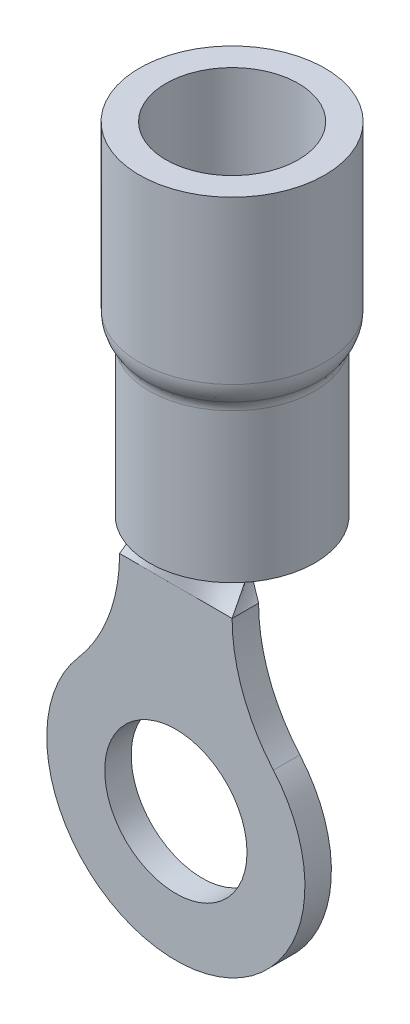
ISO-10303-21;
HEADER;
FILE_DESCRIPTION(('STEP AP214'),'2;1');
FILE_NAME('part.step','',(''),(''),'','','');
FILE_SCHEMA(('AUTOMOTIVE_DESIGN { 1 0 10303 214 1 1 1 1 }'));
ENDSEC;
DATA;
#1=APPLICATION_CONTEXT('core data for automotive mechanical design processes');
#2=APPLICATION_PROTOCOL_DEFINITION('international standard','automotive_design',2000,#1);
#3=PRODUCT_CONTEXT('',#1,'mechanical');
#4=PRODUCT('Part','Part','',(#3));
#5=PRODUCT_RELATED_PRODUCT_CATEGORY('part','',(#4));
#6=PRODUCT_DEFINITION_FORMATION('','',#4);
#7=PRODUCT_DEFINITION_CONTEXT('part definition',#1,'design');
#8=PRODUCT_DEFINITION('design','',#6,#7);
#9=PRODUCT_DEFINITION_SHAPE('','',#8);
#10=(LENGTH_UNIT() NAMED_UNIT(*) SI_UNIT(.MILLI.,.METRE.));
#11=(NAMED_UNIT(*) PLANE_ANGLE_UNIT() SI_UNIT($,.RADIAN.));
#12=(NAMED_UNIT(*) SI_UNIT($,.STERADIAN.) SOLID_ANGLE_UNIT());
#13=UNCERTAINTY_MEASURE_WITH_UNIT(LENGTH_MEASURE(1.E-05),#10,'distance_accuracy_value','');
#14=(GEOMETRIC_REPRESENTATION_CONTEXT(3) GLOBAL_UNCERTAINTY_ASSIGNED_CONTEXT((#13)) GLOBAL_UNIT_ASSIGNED_CONTEXT((#10,
#11,#12)) REPRESENTATION_CONTEXT('',''));
#15=CARTESIAN_POINT('',(0.,0.,0.));
#16=DIRECTION('',(0.,0.,1.));
#17=DIRECTION('',(1.,0.,0.));
#18=AXIS2_PLACEMENT_3D('',#15,#16,#17);
#19=CARTESIAN_POINT('',(-6.811363636364,0.,0.));
#20=DIRECTION('',(0.,0.,1.));
#21=DIRECTION('',(1.,0.,0.));
#22=AXIS2_PLACEMENT_3D('',#19,#20,#21);
#23=CYLINDRICAL_SURFACE('',#22,5.111363636364);
#24=DIRECTION('',(0.,0.,-1.));
#25=VECTOR('',#24,1.);
#26=CARTESIAN_POINT('',(-2.947868852459,-3.346557377049,0.));
#27=LINE('',#26,#25);
#28=CARTESIAN_POINT('',(-2.947868852459,-3.346557377049,0.));
#29=VERTEX_POINT('',#28);
#30=CARTESIAN_POINT('',(-2.947868852459,-3.346557377049,-0.8));
#31=VERTEX_POINT('',#30);
#32=EDGE_CURVE('E12',#29,#31,#27,.T.);
#33=ORIENTED_EDGE('',*,*,#32,.F.);
#34=CARTESIAN_POINT('',(-6.811363636364,0.,0.));
#35=DIRECTION('',(0.,0.,1.));
#36=DIRECTION('',(1.,0.,0.));
#37=AXIS2_PLACEMENT_3D('',#34,#35,#36);
#38=CIRCLE('',#37,5.111363636364);
#39=CARTESIAN_POINT('',(-1.7,0.,0.));
#40=VERTEX_POINT('',#39);
#41=EDGE_CURVE('E125',#29,#40,#38,.T.);
#42=ORIENTED_EDGE('',*,*,#41,.T.);
#43=DIRECTION('',(0.,0.,-1.));
#44=VECTOR('',#43,1.);
#45=CARTESIAN_POINT('',(-1.7,0.,0.));
#46=LINE('',#45,#44);
#47=CARTESIAN_POINT('',(-1.7,0.,-0.8));
#48=VERTEX_POINT('',#47);
#49=EDGE_CURVE('E146',#40,#48,#46,.T.);
#50=ORIENTED_EDGE('',*,*,#49,.T.);
#51=CARTESIAN_POINT('',(-6.811363636364,0.,-0.8));
#52=DIRECTION('',(0.,0.,1.));
#53=DIRECTION('',(1.,0.,0.));
#54=AXIS2_PLACEMENT_3D('',#51,#52,#53);
#55=CIRCLE('',#54,5.111363636364);
#56=EDGE_CURVE('E67',#31,#48,#55,.T.);
#57=ORIENTED_EDGE('',*,*,#56,.F.);
#58=EDGE_LOOP('',(#33,#42,#50,#57));
#59=FACE_BOUND('',#58,.T.);
#60=ADVANCED_FACE('F56',(#59),#23,.F.);
#61=CARTESIAN_POINT('',(0.,-5.9,0.));
#62=DIRECTION('',(0.,0.,1.));
#63=DIRECTION('',(1.,0.,0.));
#64=AXIS2_PLACEMENT_3D('',#61,#62,#63);
#65=CYLINDRICAL_SURFACE('',#64,3.9);
#66=CARTESIAN_POINT('',(0.,-5.9,0.));
#67=DIRECTION('',(0.,0.,1.));
#68=DIRECTION('',(1.,0.,0.));
#69=AXIS2_PLACEMENT_3D('',#66,#67,#68);
#70=CIRCLE('',#69,3.9);
#71=CARTESIAN_POINT('',(2.947868852459,-3.346557377049,0.));
#72=VERTEX_POINT('',#71);
#73=EDGE_CURVE('E60',#29,#72,#70,.T.);
#74=ORIENTED_EDGE('',*,*,#73,.F.);
#75=ORIENTED_EDGE('',*,*,#32,.T.);
#76=CARTESIAN_POINT('',(0.,-5.9,-0.8));
#77=DIRECTION('',(0.,0.,1.));
#78=DIRECTION('',(1.,0.,0.));
#79=AXIS2_PLACEMENT_3D('',#76,#77,#78);
#80=CIRCLE('',#79,3.9);
#81=CARTESIAN_POINT('',(2.947868852459,-3.346557377049,-0.8));
#82=VERTEX_POINT('',#81);
#83=EDGE_CURVE('E80',#31,#82,#80,.T.);
#84=ORIENTED_EDGE('',*,*,#83,.T.);
#85=DIRECTION('',(0.,0.,-1.));
#86=VECTOR('',#85,1.);
#87=CARTESIAN_POINT('',(2.947868852459,-3.346557377049,0.));
#88=LINE('',#87,#86);
#89=EDGE_CURVE('E117',#72,#82,#88,.T.);
#90=ORIENTED_EDGE('',*,*,#89,.F.);
#91=EDGE_LOOP('',(#74,#75,#84,#90));
#92=FACE_BOUND('',#91,.T.);
#93=ADVANCED_FACE('F58',(#92),#65,.T.);
#94=CARTESIAN_POINT('',(6.811363636364,0.,0.));
#95=DIRECTION('',(0.,0.,1.));
#96=DIRECTION('',(1.,0.,0.));
#97=AXIS2_PLACEMENT_3D('',#94,#95,#96);
#98=CYLINDRICAL_SURFACE('',#97,5.111363636364);
#99=DIRECTION('',(0.,0.,-1.));
#100=VECTOR('',#99,1.);
#101=CARTESIAN_POINT('',(1.7,0.,0.));
#102=LINE('',#101,#100);
#103=CARTESIAN_POINT('',(1.7,0.,0.));
#104=VERTEX_POINT('',#103);
#105=CARTESIAN_POINT('',(1.7,0.,-0.8));
#106=VERTEX_POINT('',#105);
#107=EDGE_CURVE('E119',#104,#106,#102,.T.);
#108=ORIENTED_EDGE('',*,*,#107,.F.);
#109=CARTESIAN_POINT('',(6.811363636364,0.,0.));
#110=DIRECTION('',(0.,0.,1.));
#111=DIRECTION('',(1.,0.,0.));
#112=AXIS2_PLACEMENT_3D('',#109,#110,#111);
#113=CIRCLE('',#112,5.111363636364);
#114=EDGE_CURVE('E114',#104,#72,#113,.T.);
#115=ORIENTED_EDGE('',*,*,#114,.T.);
#116=ORIENTED_EDGE('',*,*,#89,.T.);
#117=CARTESIAN_POINT('',(6.811363636364,0.,-0.8));
#118=DIRECTION('',(0.,0.,1.));
#119=DIRECTION('',(1.,0.,0.));
#120=AXIS2_PLACEMENT_3D('',#117,#118,#119);
#121=CIRCLE('',#120,5.111363636364);
#122=EDGE_CURVE('E106',#106,#82,#121,.T.);
#123=ORIENTED_EDGE('',*,*,#122,.F.);
#124=EDGE_LOOP('',(#108,#115,#116,#123));
#125=FACE_BOUND('',#124,.T.);
#126=ADVANCED_FACE('F116',(#125),#98,.F.);
#127=CARTESIAN_POINT('',(-1.7,0.,0.));
#128=DIRECTION('',(0.,1.,0.));
#129=DIRECTION('',(1.,0.,0.));
#130=AXIS2_PLACEMENT_3D('',#127,#128,#129);
#131=PLANE('',#130);
#132=ORIENTED_EDGE('',*,*,#49,.F.);
#133=DIRECTION('',(1.,0.,0.));
#134=VECTOR('',#133,1.);
#135=CARTESIAN_POINT('',(-1.7,0.,0.));
#136=LINE('',#135,#134);
#137=EDGE_CURVE('E124',#40,#104,#136,.T.);
#138=ORIENTED_EDGE('',*,*,#137,.T.);
#139=ORIENTED_EDGE('',*,*,#107,.T.);
#140=DIRECTION('',(1.,0.,0.));
#141=VECTOR('',#140,1.);
#142=CARTESIAN_POINT('',(-1.7,0.,-0.8));
#143=LINE('',#142,#141);
#144=EDGE_CURVE('E149',#48,#106,#143,.T.);
#145=ORIENTED_EDGE('',*,*,#144,.F.);
#146=EDGE_LOOP('',(#132,#138,#139,#145));
#147=FACE_BOUND('',#146,.T.);
#148=ADVANCED_FACE('F192',(#147),#131,.T.);
#149=CARTESIAN_POINT('',(0.,-5.9,0.));
#150=DIRECTION('',(0.,0.,1.));
#151=DIRECTION('',(1.,0.,0.));
#152=AXIS2_PLACEMENT_3D('',#149,#150,#151);
#153=CYLINDRICAL_SURFACE('',#152,2.15);
#154=DIRECTION('',(0.,0.,-1.));
#155=VECTOR('',#154,1.);
#156=CARTESIAN_POINT('',(2.15,-5.9,0.));
#157=LINE('',#156,#155);
#158=CARTESIAN_POINT('',(2.15,-5.9,0.));
#159=VERTEX_POINT('',#158);
#160=CARTESIAN_POINT('',(2.15,-5.9,-0.8));
#161=VERTEX_POINT('',#160);
#162=EDGE_CURVE('E151',#159,#161,#157,.T.);
#163=ORIENTED_EDGE('',*,*,#162,.F.);
#164=CARTESIAN_POINT('',(0.,-5.9,0.));
#165=DIRECTION('',(0.,0.,1.));
#166=DIRECTION('',(1.,0.,0.));
#167=AXIS2_PLACEMENT_3D('',#164,#165,#166);
#168=CIRCLE('',#167,2.15);
#169=EDGE_CURVE('E278',#159,#159,#168,.T.);
#170=ORIENTED_EDGE('',*,*,#169,.T.);
#171=ORIENTED_EDGE('',*,*,#162,.T.);
#172=CARTESIAN_POINT('',(0.,-5.9,-0.8));
#173=DIRECTION('',(0.,0.,1.));
#174=DIRECTION('',(1.,0.,0.));
#175=AXIS2_PLACEMENT_3D('',#172,#173,#174);
#176=CIRCLE('',#175,2.15);
#177=EDGE_CURVE('E154',#161,#161,#176,.T.);
#178=ORIENTED_EDGE('',*,*,#177,.F.);
#179=EDGE_LOOP('',(#163,#170,#171,#178));
#180=FACE_BOUND('',#179,.T.);
#181=ADVANCED_FACE('F186',(#180),#153,.F.);
#182=CARTESIAN_POINT('',(0.,-5.013028675875,0.));
#183=DIRECTION('',(0.,0.,-1.));
#184=DIRECTION('',(1.,0.,0.));
#185=AXIS2_PLACEMENT_3D('',#182,#183,#184);
#186=PLANE('',#185);
#187=ORIENTED_EDGE('',*,*,#137,.F.);
#188=ORIENTED_EDGE('',*,*,#41,.F.);
#189=ORIENTED_EDGE('',*,*,#73,.T.);
#190=ORIENTED_EDGE('',*,*,#114,.F.);
#191=EDGE_LOOP('',(#187,#188,#189,#190));
#192=FACE_BOUND('',#191,.T.);
#193=ORIENTED_EDGE('',*,*,#169,.F.);
#194=EDGE_LOOP('',(#193));
#195=FACE_BOUND('',#194,.T.);
#196=ADVANCED_FACE('F131',(#192,#195),#186,.F.);
#197=CARTESIAN_POINT('',(0.,-5.013028675875,-0.8));
#198=DIRECTION('',(0.,0.,-1.));
#199=DIRECTION('',(1.,0.,0.));
#200=AXIS2_PLACEMENT_3D('',#197,#198,#199);
#201=PLANE('',#200);
#202=ORIENTED_EDGE('',*,*,#56,.T.);
#203=ORIENTED_EDGE('',*,*,#144,.T.);
#204=ORIENTED_EDGE('',*,*,#122,.T.);
#205=ORIENTED_EDGE('',*,*,#83,.F.);
#206=EDGE_LOOP('',(#202,#203,#204,#205));
#207=FACE_BOUND('',#206,.T.);
#208=ORIENTED_EDGE('',*,*,#177,.T.);
#209=EDGE_LOOP('',(#208));
#210=FACE_BOUND('',#209,.T.);
#211=ADVANCED_FACE('F200',(#207,#210),#201,.T.);
#212=CLOSED_SHELL('',(#60,#93,#126,#148,#181,#196,#211));
#213=MANIFOLD_SOLID_BREP('B2',#212);
#214=CARTESIAN_POINT('',(1.472243186433,1.,-0.85));
#215=CARTESIAN_POINT('',(1.7,0.,-4.101163852965E-13));
#216=CARTESIAN_POINT('',(0.779422559986,1.,-1.25000017518));
#217=CARTESIAN_POINT('',(1.7,0.,-0.8));
#218=(BOUNDED_SURFACE() B_SPLINE_SURFACE(1,1,((#214,#215),(#216,#217)),.UNSPECIFIED.,.F.,.F.,
.F.) B_SPLINE_SURFACE_WITH_KNOTS((2,2),(2,2),(-0.80000035036,0.),(0.,1.),
.UNSPECIFIED.) GEOMETRIC_REPRESENTATION_ITEM() RATIONAL_B_SPLINE_SURFACE(((1.,1.),(1.,1.))) REPRESENTATION_ITEM('') SURFACE());
#219=DIRECTION('',(-0.866025403784329,0.,-0.50000000000019));
#220=VECTOR('',#219,1.);
#221=CARTESIAN_POINT('',(0.779422559986,1.,-1.25000017518));
#222=LINE('',#221,#220);
#223=CARTESIAN_POINT('',(1.472243186433,1.,-0.85));
#224=VERTEX_POINT('',#223);
#225=CARTESIAN_POINT('',(0.779422559985,1.,-1.25000017518));
#226=VERTEX_POINT('',#225);
#227=EDGE_CURVE('E54',#224,#226,#222,.T.);
#228=CARTESIAN_POINT('',(1.472243186433,1.,-0.85));
#229=CARTESIAN_POINT('',(1.7,0.,-4.101163852965E-13));
#230=(BOUNDED_CURVE() B_SPLINE_CURVE(1,(#228,#229),.UNSPECIFIED.,.F.,
.F.) B_SPLINE_CURVE_WITH_KNOTS((2,2),(0.,1.),
.UNSPECIFIED.) CURVE() GEOMETRIC_REPRESENTATION_ITEM() RATIONAL_B_SPLINE_CURVE((1.,1.)) REPRESENTATION_ITEM(''));
#231=CARTESIAN_POINT('',(1.7,0.,-4.101163852965E-13));
#232=VERTEX_POINT('',#231);
#233=EDGE_CURVE('E394',#224,#232,#230,.T.);
#234=DIRECTION('',(0.,0.,1.));
#235=VECTOR('',#234,1.);
#236=CARTESIAN_POINT('',(1.7,0.,-0.8));
#237=LINE('',#236,#235);
#238=CARTESIAN_POINT('',(1.7,0.,-0.8));
#239=VERTEX_POINT('',#238);
#240=EDGE_CURVE('E389',#239,#232,#237,.T.);
#241=CARTESIAN_POINT('',(0.779422559986,1.,-1.25000017518));
#242=CARTESIAN_POINT('',(1.7,0.,-0.8));
#243=(BOUNDED_CURVE() B_SPLINE_CURVE(1,(#241,#242),.UNSPECIFIED.,.F.,
.F.) B_SPLINE_CURVE_WITH_KNOTS((2,2),(0.,1.),
.UNSPECIFIED.) CURVE() GEOMETRIC_REPRESENTATION_ITEM() RATIONAL_B_SPLINE_CURVE((1.,1.)) REPRESENTATION_ITEM(''));
#244=EDGE_CURVE('E343',#226,#239,#243,.T.);
#245=ORIENTED_EDGE('',*,*,#227,.F.);
#246=ORIENTED_EDGE('',*,*,#233,.T.);
#247=ORIENTED_EDGE('',*,*,#240,.F.);
#248=ORIENTED_EDGE('',*,*,#244,.F.);
#249=EDGE_LOOP('',(#245,#246,#247,#248));
#250=FACE_BOUND('',#249,.T.);
#251=ADVANCED_FACE('F332',(#250),#218,.F.);
#252=CARTESIAN_POINT('',(0.779422559985,1.,-1.25000017518));
#253=CARTESIAN_POINT('',(1.7,0.,-0.8));
#254=CARTESIAN_POINT('',(0.661612881338,1.,-1.045947720225));
#255=CARTESIAN_POINT('',(1.275,0.,-0.8));
#256=CARTESIAN_POINT('',(0.482749875849,1.,-0.87714376313));
#257=CARTESIAN_POINT('',(0.85,0.,-0.8));
#258=CARTESIAN_POINT('',(0.255145395893,1.,-0.764900349193));
#259=CARTESIAN_POINT('',(0.425,0.,-0.8));
#260=CARTESIAN_POINT('',(-1.8550688458E-07,1.,-0.725370883051));
#261=CARTESIAN_POINT('',(2.2692E-13,0.,-0.8));
#262=CARTESIAN_POINT('',(-0.255145784675,1.,-0.764900234502));
#263=CARTESIAN_POINT('',(-0.425,0.,-0.8));
#264=CARTESIAN_POINT('',(-0.482750315087,1.,-0.877143546128));
#265=CARTESIAN_POINT('',(-0.85,0.,-0.8));
#266=CARTESIAN_POINT('',(-0.661613396455,1.,-1.045947422822));
#267=CARTESIAN_POINT('',(-1.275,0.,-0.8));
#268=CARTESIAN_POINT('',(-0.779423166826,1.,-1.24999982482));
#269=CARTESIAN_POINT('',(-1.7,0.,-0.8));
#270=(BOUNDED_SURFACE() B_SPLINE_SURFACE(8,1,((#252,#253),(#254,#255),(#256,#257),(#258,#259),
(#260,#261),(#262,#263),(#264,#265),(#266,#267),(#268,#269)),.UNSPECIFIED.,.F.,.F.,
.F.) B_SPLINE_SURFACE_WITH_KNOTS((9,9),(2,2),(-3.4,0.),(0.,1.),
.UNSPECIFIED.) GEOMETRIC_REPRESENTATION_ITEM() RATIONAL_B_SPLINE_SURFACE(((1.,1.),(1.,1.),(1.,
1.),(1.,1.),(1.,1.),(1.,1.),(1.,1.),(1.,1.),(1.,1.))) REPRESENTATION_ITEM('') SURFACE());
#271=CARTESIAN_POINT('',(-4.045605237E-07,1.,-1.7));
#272=DIRECTION('',(0.,-1.,0.));
#273=DIRECTION('',(1.,0.,0.));
#274=AXIS2_PLACEMENT_3D('',#271,#272,#273);
#275=CIRCLE('',#274,0.9);
#276=CARTESIAN_POINT('',(-0.779423166826,1.,-1.24999982482));
#277=VERTEX_POINT('',#276);
#278=EDGE_CURVE('E356',#226,#277,#275,.T.);
#279=DIRECTION('',(1.,0.,0.));
#280=VECTOR('',#279,1.);
#281=CARTESIAN_POINT('',(-1.7,0.,-0.8));
#282=LINE('',#281,#280);
#283=CARTESIAN_POINT('',(-1.7,0.,-0.8));
#284=VERTEX_POINT('',#283);
#285=EDGE_CURVE('E336',#284,#239,#282,.T.);
#286=CARTESIAN_POINT('',(-0.779423166826,1.,-1.24999982482));
#287=CARTESIAN_POINT('',(-1.7,0.,-0.8));
#288=(BOUNDED_CURVE() B_SPLINE_CURVE(1,(#286,#287),.UNSPECIFIED.,.F.,
.F.) B_SPLINE_CURVE_WITH_KNOTS((2,2),(0.,1.),
.UNSPECIFIED.) CURVE() GEOMETRIC_REPRESENTATION_ITEM() RATIONAL_B_SPLINE_CURVE((1.,1.)) REPRESENTATION_ITEM(''));
#289=EDGE_CURVE('E407',#277,#284,#288,.T.);
#290=ORIENTED_EDGE('',*,*,#278,.F.);
#291=ORIENTED_EDGE('',*,*,#244,.T.);
#292=ORIENTED_EDGE('',*,*,#285,.F.);
#293=ORIENTED_EDGE('',*,*,#289,.F.);
#294=EDGE_LOOP('',(#290,#291,#292,#293));
#295=FACE_BOUND('',#294,.T.);
#296=ADVANCED_FACE('F445',(#295),#270,.F.);
#297=CARTESIAN_POINT('',(-0.779423166826,1.,-1.24999982482));
#298=CARTESIAN_POINT('',(-1.7,0.,-0.8));
#299=CARTESIAN_POINT('',(-1.472243186433,1.,-0.85));
#300=CARTESIAN_POINT('',(-1.7,0.,-4.101163852965E-13));
#301=(BOUNDED_SURFACE() B_SPLINE_SURFACE(1,1,((#297,#298),(#299,#300)),.UNSPECIFIED.,.F.,.F.,
.F.) B_SPLINE_SURFACE_WITH_KNOTS((2,2),(2,2),(-0.8,0.),(0.,1.),
.UNSPECIFIED.) GEOMETRIC_REPRESENTATION_ITEM() RATIONAL_B_SPLINE_SURFACE(((1.,1.),(1.,1.))) REPRESENTATION_ITEM('') SURFACE());
#302=DIRECTION('',(-0.866025403784579,0.,0.499999999999757));
#303=VECTOR('',#302,1.);
#304=CARTESIAN_POINT('',(-0.779423166826,1.,-1.24999982482));
#305=LINE('',#304,#303);
#306=CARTESIAN_POINT('',(-1.472243186433,1.,-0.85));
#307=VERTEX_POINT('',#306);
#308=EDGE_CURVE('E404',#277,#307,#305,.T.);
#309=DIRECTION('',(0.,0.,-1.));
#310=VECTOR('',#309,1.);
#311=CARTESIAN_POINT('',(-1.7,0.,-4.101163852965E-13));
#312=LINE('',#311,#310);
#313=CARTESIAN_POINT('',(-1.7,0.,-4.101163852965E-13));
#314=VERTEX_POINT('',#313);
#315=EDGE_CURVE('E386',#314,#284,#312,.T.);
#316=CARTESIAN_POINT('',(-1.472243186433,1.,-0.85));
#317=CARTESIAN_POINT('',(-1.7,0.,-4.101163852965E-13));
#318=(BOUNDED_CURVE() B_SPLINE_CURVE(1,(#316,#317),.UNSPECIFIED.,.F.,
.F.) B_SPLINE_CURVE_WITH_KNOTS((2,2),(0.,1.),
.UNSPECIFIED.) CURVE() GEOMETRIC_REPRESENTATION_ITEM() RATIONAL_B_SPLINE_CURVE((1.,1.)) REPRESENTATION_ITEM(''));
#319=EDGE_CURVE('E397',#307,#314,#318,.T.);
#320=ORIENTED_EDGE('',*,*,#308,.F.);
#321=ORIENTED_EDGE('',*,*,#289,.T.);
#322=ORIENTED_EDGE('',*,*,#315,.F.);
#323=ORIENTED_EDGE('',*,*,#319,.F.);
#324=EDGE_LOOP('',(#320,#321,#322,#323));
#325=FACE_BOUND('',#324,.T.);
#326=ADVANCED_FACE('F406',(#325),#301,.F.);
#327=CARTESIAN_POINT('',(-1.472243186433,1.,-0.85));
#328=CARTESIAN_POINT('',(-1.7,0.,-4.096722960867E-13));
#329=CARTESIAN_POINT('',(-1.249713706804,1.,-0.4645676351));
#330=CARTESIAN_POINT('',(-1.275,0.,-4.096722960867E-13));
#331=CARTESIAN_POINT('',(-0.91186129144,1.,-0.145715792077));
#332=CARTESIAN_POINT('',(-0.85,0.,-4.096722960867E-13));
#333=CARTESIAN_POINT('',(-0.481941670537,1.,0.06629944873295));
#334=CARTESIAN_POINT('',(-0.425,0.,-4.096722960867E-13));
#335=CARTESIAN_POINT('',(0.,1.,0.140966109792));
#336=CARTESIAN_POINT('',(2.2694E-13,0.,-4.096722960867E-13));
#337=CARTESIAN_POINT('',(0.481941670537,1.,0.06629944873292));
#338=CARTESIAN_POINT('',(0.425,0.,-4.096722960867E-13));
#339=CARTESIAN_POINT('',(0.91186129144,1.,-0.145715792077));
#340=CARTESIAN_POINT('',(0.85,0.,-4.096722960867E-13));
#341=CARTESIAN_POINT('',(1.249713706804,1.,-0.4645676351));
#342=CARTESIAN_POINT('',(1.275,0.,-4.096722960867E-13));
#343=CARTESIAN_POINT('',(1.472243186433,1.,-0.85));
#344=CARTESIAN_POINT('',(1.7,0.,-4.096722960867E-13));
#345=(BOUNDED_SURFACE() B_SPLINE_SURFACE(8,1,((#327,#328),(#329,#330),(#331,#332),(#333,#334),
(#335,#336),(#337,#338),(#339,#340),(#341,#342),(#343,#344)),.UNSPECIFIED.,.F.,.F.,
.F.) B_SPLINE_SURFACE_WITH_KNOTS((9,9),(2,2),(-3.4,0.),(0.,1.),
.UNSPECIFIED.) GEOMETRIC_REPRESENTATION_ITEM() RATIONAL_B_SPLINE_SURFACE(((1.,1.),(1.,1.),(1.,
1.),(1.,1.),(1.,1.),(1.,1.),(1.,1.),(1.,1.),(1.,1.))) REPRESENTATION_ITEM('') SURFACE());
#346=CARTESIAN_POINT('',(0.,1.,-1.7));
#347=DIRECTION('',(0.,1.,0.));
#348=DIRECTION('',(1.,0.,0.));
#349=AXIS2_PLACEMENT_3D('',#346,#347,#348);
#350=CIRCLE('',#349,1.7);
#351=EDGE_CURVE('E399',#307,#224,#350,.T.);
#352=DIRECTION('',(-1.,0.,0.));
#353=VECTOR('',#352,1.);
#354=CARTESIAN_POINT('',(1.7,0.,-4.101163852965E-13));
#355=LINE('',#354,#353);
#356=EDGE_CURVE('E383',#232,#314,#355,.T.);
#357=ORIENTED_EDGE('',*,*,#351,.F.);
#358=ORIENTED_EDGE('',*,*,#319,.T.);
#359=ORIENTED_EDGE('',*,*,#356,.F.);
#360=ORIENTED_EDGE('',*,*,#233,.F.);
#361=EDGE_LOOP('',(#357,#358,#359,#360));
#362=FACE_BOUND('',#361,.T.);
#363=ADVANCED_FACE('F398',(#362),#345,.F.);
#364=CARTESIAN_POINT('',(-4.045605237E-07,1.,-1.7));
#365=DIRECTION('',(0.,1.,0.));
#366=DIRECTION('',(1.,0.,0.));
#367=AXIS2_PLACEMENT_3D('',#364,#365,#366);
#368=PLANE('',#367);
#369=ORIENTED_EDGE('',*,*,#351,.T.);
#370=ORIENTED_EDGE('',*,*,#227,.T.);
#371=ORIENTED_EDGE('',*,*,#278,.T.);
#372=ORIENTED_EDGE('',*,*,#308,.T.);
#373=EDGE_LOOP('',(#369,#370,#371,#372));
#374=FACE_BOUND('',#373,.T.);
#375=ADVANCED_FACE('F515',(#374),#368,.T.);
#376=CARTESIAN_POINT('',(1.7,0.,-0.8));
#377=DIRECTION('',(0.,-1.,0.));
#378=DIRECTION('',(-1.,0.,0.));
#379=AXIS2_PLACEMENT_3D('',#376,#377,#378);
#380=PLANE('',#379);
#381=ORIENTED_EDGE('',*,*,#240,.T.);
#382=ORIENTED_EDGE('',*,*,#356,.T.);
#383=ORIENTED_EDGE('',*,*,#315,.T.);
#384=ORIENTED_EDGE('',*,*,#285,.T.);
#385=EDGE_LOOP('',(#381,#382,#383,#384));
#386=FACE_BOUND('',#385,.T.);
#387=ADVANCED_FACE('F334',(#386),#380,.T.);
#388=CLOSED_SHELL('',(#251,#296,#326,#363,#375,#387));
#389=MANIFOLD_SOLID_BREP('B6',#388);
#390=CARTESIAN_POINT('',(0.,5.5,-1.819913438867));
#391=DIRECTION('',(0.,-1.,0.));
#392=DIRECTION('',(-1.,0.,0.));
#393=AXIS2_PLACEMENT_3D('',#390,#391,#392);
#394=PLANE('',#393);
#395=CARTESIAN_POINT('',(0.,5.5,-1.7));
#396=DIRECTION('',(0.,-1.,0.));
#397=DIRECTION('',(1.,0.,0.));
#398=AXIS2_PLACEMENT_3D('',#395,#396,#397);
#399=CIRCLE('',#398,0.9);
#400=CARTESIAN_POINT('',(0.,5.5,-0.8));
#401=VERTEX_POINT('',#400);
#402=CARTESIAN_POINT('',(-0.276923076923,5.5,-2.556337322244));
#403=VERTEX_POINT('',#402);
#404=EDGE_CURVE('E716',#401,#403,#399,.T.);
#405=ORIENTED_EDGE('',*,*,#404,.T.);
#406=CARTESIAN_POINT('',(-0.4,5.5,-2.936931687685));
#407=DIRECTION('',(0.,1.,0.));
#408=DIRECTION('',(1.,0.,0.));
#409=AXIS2_PLACEMENT_3D('',#406,#407,#408);
#410=CIRCLE('',#409,0.4);
#411=CARTESIAN_POINT('',(0.,5.5,-2.936931687685));
#412=VERTEX_POINT('',#411);
#413=EDGE_CURVE('E703',#403,#412,#410,.T.);
#414=ORIENTED_EDGE('',*,*,#413,.T.);
#415=CARTESIAN_POINT('',(-0.523076923077,5.5,-3.317526053127));
#416=VERTEX_POINT('',#415);
#417=EDGE_CURVE('E690',#412,#416,#410,.T.);
#418=ORIENTED_EDGE('',*,*,#417,.T.);
#419=CARTESIAN_POINT('',(0.,5.5,-1.7));
#420=DIRECTION('',(0.,1.,0.));
#421=DIRECTION('',(1.,0.,0.));
#422=AXIS2_PLACEMENT_3D('',#419,#420,#421);
#423=CIRCLE('',#422,1.7);
#424=CARTESIAN_POINT('',(0.,5.5,0.));
#425=VERTEX_POINT('',#424);
#426=EDGE_CURVE('E695',#416,#425,#423,.T.);
#427=ORIENTED_EDGE('',*,*,#426,.T.);
#428=DIRECTION('',(0.,0.,1.));
#429=VECTOR('',#428,1.);
#430=CARTESIAN_POINT('',(0.,5.5,-1.819913438867));
#431=LINE('',#430,#429);
#432=EDGE_CURVE('E330',#401,#425,#431,.T.);
#433=ORIENTED_EDGE('',*,*,#432,.F.);
#434=EDGE_LOOP('',(#405,#414,#418,#427,#433));
#435=FACE_BOUND('',#434,.T.);
#436=ADVANCED_FACE('F609',(#435),#394,.F.);
#437=CARTESIAN_POINT('',(0.,1.,-1.819913438867));
#438=DIRECTION('',(0.,-1.,0.));
#439=DIRECTION('',(-1.,0.,0.));
#440=AXIS2_PLACEMENT_3D('',#437,#438,#439);
#441=PLANE('',#440);
#442=CARTESIAN_POINT('',(0.,1.,-1.7));
#443=DIRECTION('',(0.,-1.,0.));
#444=DIRECTION('',(1.,0.,0.));
#445=AXIS2_PLACEMENT_3D('',#442,#443,#444);
#446=CIRCLE('',#445,0.9);
#447=CARTESIAN_POINT('',(0.276923076923,1.,-2.556337322244));
#448=VERTEX_POINT('',#447);
#449=CARTESIAN_POINT('',(0.,1.,-0.8));
#450=VERTEX_POINT('',#449);
#451=EDGE_CURVE('E730',#448,#450,#446,.T.);
#452=ORIENTED_EDGE('',*,*,#451,.F.);
#453=CARTESIAN_POINT('',(0.4,1.,-2.936931687685));
#454=DIRECTION('',(0.,1.,0.));
#455=DIRECTION('',(1.,0.,0.));
#456=AXIS2_PLACEMENT_3D('',#453,#454,#455);
#457=CIRCLE('',#456,0.4);
#458=CARTESIAN_POINT('',(0.,1.,-2.936931687685));
#459=VERTEX_POINT('',#458);
#460=EDGE_CURVE('E734',#459,#448,#457,.T.);
#461=ORIENTED_EDGE('',*,*,#460,.F.);
#462=CARTESIAN_POINT('',(0.523076923077,1.,-3.317526053127));
#463=VERTEX_POINT('',#462);
#464=EDGE_CURVE('E736',#463,#459,#457,.T.);
#465=ORIENTED_EDGE('',*,*,#464,.F.);
#466=CARTESIAN_POINT('',(0.,1.,-1.7));
#467=DIRECTION('',(0.,1.,0.));
#468=DIRECTION('',(1.,0.,0.));
#469=AXIS2_PLACEMENT_3D('',#466,#467,#468);
#470=CIRCLE('',#469,1.7);
#471=CARTESIAN_POINT('',(0.,1.,0.));
#472=VERTEX_POINT('',#471);
#473=EDGE_CURVE('E728',#472,#463,#470,.T.);
#474=ORIENTED_EDGE('',*,*,#473,.F.);
#475=DIRECTION('',(0.,0.,1.));
#476=VECTOR('',#475,1.);
#477=CARTESIAN_POINT('',(0.,1.,-1.819913438867));
#478=LINE('',#477,#476);
#479=EDGE_CURVE('E617',#450,#472,#478,.T.);
#480=ORIENTED_EDGE('',*,*,#479,.F.);
#481=EDGE_LOOP('',(#452,#461,#465,#474,#480));
#482=FACE_BOUND('',#481,.T.);
#483=ADVANCED_FACE('F754',(#482),#441,.T.);
#484=CARTESIAN_POINT('',(-0.4,1.,-2.936931687685));
#485=DIRECTION('',(0.,-1.,0.));
#486=DIRECTION('',(1.,0.,0.));
#487=AXIS2_PLACEMENT_3D('',#484,#485,#486);
#488=CYLINDRICAL_SURFACE('',#487,0.4);
#489=DIRECTION('',(0.,1.,0.));
#490=VECTOR('',#489,1.);
#491=CARTESIAN_POINT('',(-0.276923076923,1.,-2.556337322244));
#492=LINE('',#491,#490);
#493=CARTESIAN_POINT('',(-0.276923076923,1.,-2.556337322244));
#494=VERTEX_POINT('',#493);
#495=EDGE_CURVE('E711',#494,#403,#492,.T.);
#496=ORIENTED_EDGE('',*,*,#495,.F.);
#497=CARTESIAN_POINT('',(-0.4,1.,-2.936931687685));
#498=DIRECTION('',(0.,1.,0.));
#499=DIRECTION('',(1.,0.,0.));
#500=AXIS2_PLACEMENT_3D('',#497,#498,#499);
#501=CIRCLE('',#500,0.4);
#502=CARTESIAN_POINT('',(0.,1.,-2.936931687685));
#503=VERTEX_POINT('',#502);
#504=EDGE_CURVE('E717',#494,#503,#501,.T.);
#505=ORIENTED_EDGE('',*,*,#504,.T.);
#506=CARTESIAN_POINT('',(-0.523076923077,1.,-3.317526053127));
#507=VERTEX_POINT('',#506);
#508=EDGE_CURVE('E693',#503,#507,#501,.T.);
#509=ORIENTED_EDGE('',*,*,#508,.T.);
#510=DIRECTION('',(0.,1.,0.));
#511=VECTOR('',#510,1.);
#512=CARTESIAN_POINT('',(-0.523076923077,1.,-3.317526053127));
#513=LINE('',#512,#511);
#514=EDGE_CURVE('E685',#507,#416,#513,.T.);
#515=ORIENTED_EDGE('',*,*,#514,.T.);
#516=ORIENTED_EDGE('',*,*,#417,.F.);
#517=ORIENTED_EDGE('',*,*,#413,.F.);
#518=EDGE_LOOP('',(#496,#505,#509,#515,#516,#517));
#519=FACE_BOUND('',#518,.T.);
#520=ADVANCED_FACE('F687',(#519),#488,.T.);
#521=CARTESIAN_POINT('',(0.,1.,-1.7));
#522=DIRECTION('',(0.,-1.,0.));
#523=DIRECTION('',(1.,0.,0.));
#524=AXIS2_PLACEMENT_3D('',#521,#522,#523);
#525=CYLINDRICAL_SURFACE('',#524,1.7);
#526=ORIENTED_EDGE('',*,*,#514,.F.);
#527=EDGE_CURVE('E726',#507,#472,#470,.T.);
#528=ORIENTED_EDGE('',*,*,#527,.T.);
#529=ORIENTED_EDGE('',*,*,#473,.T.);
#530=DIRECTION('',(0.,1.,0.));
#531=VECTOR('',#530,1.);
#532=CARTESIAN_POINT('',(0.523076923077,1.,-3.317526053127));
#533=LINE('',#532,#531);
#534=CARTESIAN_POINT('',(0.523076923077,5.5,-3.317526053127));
#535=VERTEX_POINT('',#534);
#536=EDGE_CURVE('E720',#463,#535,#533,.T.);
#537=ORIENTED_EDGE('',*,*,#536,.T.);
#538=EDGE_CURVE('E624',#425,#535,#423,.T.);
#539=ORIENTED_EDGE('',*,*,#538,.F.);
#540=ORIENTED_EDGE('',*,*,#426,.F.);
#541=EDGE_LOOP('',(#526,#528,#529,#537,#539,#540));
#542=FACE_BOUND('',#541,.T.);
#543=ADVANCED_FACE('F698',(#542),#525,.T.);
#544=CARTESIAN_POINT('',(0.4,1.,-2.936931687685));
#545=DIRECTION('',(0.,-1.,0.));
#546=DIRECTION('',(1.,0.,0.));
#547=AXIS2_PLACEMENT_3D('',#544,#545,#546);
#548=CYLINDRICAL_SURFACE('',#547,0.4);
#549=ORIENTED_EDGE('',*,*,#536,.F.);
#550=ORIENTED_EDGE('',*,*,#464,.T.);
#551=ORIENTED_EDGE('',*,*,#460,.T.);
#552=DIRECTION('',(0.,1.,0.));
#553=VECTOR('',#552,1.);
#554=CARTESIAN_POINT('',(0.276923076923,1.,-2.556337322244));
#555=LINE('',#554,#553);
#556=CARTESIAN_POINT('',(0.276923076923,5.5,-2.556337322244));
#557=VERTEX_POINT('',#556);
#558=EDGE_CURVE('E715',#448,#557,#555,.T.);
#559=ORIENTED_EDGE('',*,*,#558,.T.);
#560=CARTESIAN_POINT('',(0.4,5.5,-2.936931687685));
#561=DIRECTION('',(0.,1.,0.));
#562=DIRECTION('',(1.,0.,0.));
#563=AXIS2_PLACEMENT_3D('',#560,#561,#562);
#564=CIRCLE('',#563,0.4);
#565=CARTESIAN_POINT('',(0.,5.5,-2.936931687685));
#566=VERTEX_POINT('',#565);
#567=EDGE_CURVE('E740',#566,#557,#564,.T.);
#568=ORIENTED_EDGE('',*,*,#567,.F.);
#569=EDGE_CURVE('E723',#535,#566,#564,.T.);
#570=ORIENTED_EDGE('',*,*,#569,.F.);
#571=EDGE_LOOP('',(#549,#550,#551,#559,#568,#570));
#572=FACE_BOUND('',#571,.T.);
#573=ADVANCED_FACE('F611',(#572),#548,.T.);
#574=CARTESIAN_POINT('',(0.,1.,-1.7));
#575=DIRECTION('',(0.,-1.,0.));
#576=DIRECTION('',(1.,0.,0.));
#577=AXIS2_PLACEMENT_3D('',#574,#575,#576);
#578=CYLINDRICAL_SURFACE('',#577,0.9);
#579=ORIENTED_EDGE('',*,*,#558,.F.);
#580=ORIENTED_EDGE('',*,*,#451,.T.);
#581=EDGE_CURVE('E735',#450,#494,#446,.T.);
#582=ORIENTED_EDGE('',*,*,#581,.T.);
#583=ORIENTED_EDGE('',*,*,#495,.T.);
#584=ORIENTED_EDGE('',*,*,#404,.F.);
#585=EDGE_CURVE('E630',#557,#401,#399,.T.);
#586=ORIENTED_EDGE('',*,*,#585,.F.);
#587=EDGE_LOOP('',(#579,#580,#582,#583,#584,#586));
#588=FACE_BOUND('',#587,.T.);
#589=ADVANCED_FACE('F825',(#588),#578,.F.);
#590=ORIENTED_EDGE('',*,*,#479,.T.);
#591=ORIENTED_EDGE('',*,*,#527,.F.);
#592=ORIENTED_EDGE('',*,*,#508,.F.);
#593=ORIENTED_EDGE('',*,*,#504,.F.);
#594=ORIENTED_EDGE('',*,*,#581,.F.);
#595=EDGE_LOOP('',(#590,#591,#592,#593,#594));
#596=FACE_BOUND('',#595,.T.);
#597=ADVANCED_FACE('F748',(#596),#441,.T.);
#598=ORIENTED_EDGE('',*,*,#432,.T.);
#599=ORIENTED_EDGE('',*,*,#538,.T.);
#600=ORIENTED_EDGE('',*,*,#569,.T.);
#601=ORIENTED_EDGE('',*,*,#567,.T.);
#602=ORIENTED_EDGE('',*,*,#585,.T.);
#603=EDGE_LOOP('',(#598,#599,#600,#601,#602));
#604=FACE_BOUND('',#603,.T.);
#605=ADVANCED_FACE('F792',(#604),#394,.F.);
#606=CLOSED_SHELL('',(#436,#483,#520,#543,#573,#589,#597,#605));
#607=MANIFOLD_SOLID_BREP('B48',#606);
#608=CARTESIAN_POINT('',(0.,6.398528137424,-1.7));
#609=DIRECTION('',(0.,1.,0.));
#610=DIRECTION('',(1.,0.,0.));
#611=AXIS2_PLACEMENT_3D('',#608,#609,#610);
#612=CYLINDRICAL_SURFACE('',#611,2.8);
#613=DIRECTION('',(0.,1.,0.));
#614=VECTOR('',#613,1.);
#615=CARTESIAN_POINT('',(2.8,6.398528137424,-1.7));
#616=LINE('',#615,#614);
#617=CARTESIAN_POINT('',(2.8,6.398528137424,-1.7));
#618=VERTEX_POINT('',#617);
#619=CARTESIAN_POINT('',(2.8,11.3,-1.7));
#620=VERTEX_POINT('',#619);
#621=EDGE_CURVE('E607',#618,#620,#616,.T.);
#622=ORIENTED_EDGE('',*,*,#621,.F.);
#623=CARTESIAN_POINT('',(0.,6.398528137424,-1.7));
#624=DIRECTION('',(0.,1.,0.));
#625=DIRECTION('',(1.,0.,0.));
#626=AXIS2_PLACEMENT_3D('',#623,#624,#625);
#627=CIRCLE('',#626,2.8);
#628=EDGE_CURVE('E935',#618,#618,#627,.T.);
#629=ORIENTED_EDGE('',*,*,#628,.T.);
#630=ORIENTED_EDGE('',*,*,#621,.T.);
#631=CARTESIAN_POINT('',(0.,11.3,-1.7));
#632=DIRECTION('',(0.,1.,0.));
#633=DIRECTION('',(1.,0.,0.));
#634=AXIS2_PLACEMENT_3D('',#631,#632,#633);
#635=CIRCLE('',#634,2.8);
#636=EDGE_CURVE('E942',#620,#620,#635,.T.);
#637=ORIENTED_EDGE('',*,*,#636,.F.);
#638=EDGE_LOOP('',(#622,#629,#630,#637));
#639=FACE_BOUND('',#638,.T.);
#640=ADVANCED_FACE('F931',(#639),#612,.T.);
#641=CARTESIAN_POINT('',(0.,11.3,-1.7));
#642=DIRECTION('',(0.,-1.,0.));
#643=DIRECTION('',(-1.,0.,0.));
#644=AXIS2_PLACEMENT_3D('',#641,#642,#643);
#645=PLANE('',#644);
#646=ORIENTED_EDGE('',*,*,#636,.T.);
#647=EDGE_LOOP('',(#646));
#648=FACE_BOUND('',#647,.T.);
#649=CARTESIAN_POINT('',(0.,11.3,-1.7));
#650=DIRECTION('',(0.,1.,0.));
#651=DIRECTION('',(1.,0.,0.));
#652=AXIS2_PLACEMENT_3D('',#649,#650,#651);
#653=CIRCLE('',#652,2.);
#654=CARTESIAN_POINT('',(2.,11.3,-1.7));
#655=VERTEX_POINT('',#654);
#656=EDGE_CURVE('E1067',#655,#655,#653,.T.);
#657=ORIENTED_EDGE('',*,*,#656,.F.);
#658=EDGE_LOOP('',(#657));
#659=FACE_BOUND('',#658,.T.);
#660=ADVANCED_FACE('F1031',(#648,#659),#645,.F.);
#661=CARTESIAN_POINT('',(0.,6.600000000001,-1.7));
#662=DIRECTION('',(0.,-1.,0.));
#663=DIRECTION('',(1.,0.,0.));
#664=AXIS2_PLACEMENT_3D('',#661,#662,#663);
#665=CYLINDRICAL_SURFACE('',#664,2.);
#666=DIRECTION('',(0.,-1.,0.));
#667=VECTOR('',#666,1.);
#668=CARTESIAN_POINT('',(2.,6.600000000001,-1.7));
#669=LINE('',#668,#667);
#670=CARTESIAN_POINT('',(2.,6.600000000001,-1.7));
#671=VERTEX_POINT('',#670);
#672=EDGE_CURVE('E1071',#655,#671,#669,.T.);
#673=ORIENTED_EDGE('',*,*,#672,.F.);
#674=ORIENTED_EDGE('',*,*,#656,.T.);
#675=ORIENTED_EDGE('',*,*,#672,.T.);
#676=CARTESIAN_POINT('',(0.,6.600000000001,-1.7));
#677=DIRECTION('',(0.,1.,0.));
#678=DIRECTION('',(1.,0.,0.));
#679=AXIS2_PLACEMENT_3D('',#676,#677,#678);
#680=CIRCLE('',#679,2.);
#681=EDGE_CURVE('E1076',#671,#671,#680,.T.);
#682=ORIENTED_EDGE('',*,*,#681,.F.);
#683=EDGE_LOOP('',(#673,#674,#675,#682));
#684=FACE_BOUND('',#683,.T.);
#685=ADVANCED_FACE('F1037',(#684),#665,.F.);
#686=CARTESIAN_POINT('',(0.,5.5,-1.7));
#687=DIRECTION('',(0.,1.,0.));
#688=DIRECTION('',(1.,0.,0.));
#689=AXIS2_PLACEMENT_3D('',#686,#687,#688);
#690=CONICAL_SURFACE('',#689,0.899999999999,0.785398163397);
#691=DIRECTION('',(-0.707106781186048,-0.707106781187048,0.));
#692=VECTOR('',#691,1.);
#693=CARTESIAN_POINT('',(0.899999999999,5.5,-1.7));
#694=LINE('',#693,#692);
#695=CARTESIAN_POINT('',(0.899999999999,5.5,-1.7));
#696=VERTEX_POINT('',#695);
#697=EDGE_CURVE('E1072',#671,#696,#694,.T.);
#698=ORIENTED_EDGE('',*,*,#697,.F.);
#699=ORIENTED_EDGE('',*,*,#681,.T.);
#700=ORIENTED_EDGE('',*,*,#697,.T.);
#701=CARTESIAN_POINT('',(0.,5.5,-1.7));
#702=DIRECTION('',(0.,1.,0.));
#703=DIRECTION('',(1.,0.,0.));
#704=AXIS2_PLACEMENT_3D('',#701,#702,#703);
#705=CIRCLE('',#704,0.899999999999);
#706=EDGE_CURVE('E1061',#696,#696,#705,.T.);
#707=ORIENTED_EDGE('',*,*,#706,.F.);
#708=EDGE_LOOP('',(#698,#699,#700,#707));
#709=FACE_BOUND('',#708,.T.);
#710=ADVANCED_FACE('F1041',(#709),#690,.F.);
#711=CARTESIAN_POINT('',(0.,5.5,-1.7));
#712=DIRECTION('',(0.,-1.,0.));
#713=DIRECTION('',(-1.,0.,0.));
#714=AXIS2_PLACEMENT_3D('',#711,#712,#713);
#715=PLANE('',#714);
#716=ORIENTED_EDGE('',*,*,#706,.T.);
#717=EDGE_LOOP('',(#716));
#718=FACE_BOUND('',#717,.T.);
#719=CARTESIAN_POINT('',(0.,5.5,-1.7));
#720=DIRECTION('',(0.,1.,0.));
#721=DIRECTION('',(1.,0.,0.));
#722=AXIS2_PLACEMENT_3D('',#719,#720,#721);
#723=CIRCLE('',#722,1.699999999999);
#724=CARTESIAN_POINT('',(1.699999999999,5.5,-1.7));
#725=VERTEX_POINT('',#724);
#726=EDGE_CURVE('E1055',#725,#725,#723,.T.);
#727=ORIENTED_EDGE('',*,*,#726,.F.);
#728=EDGE_LOOP('',(#727));
#729=FACE_BOUND('',#728,.T.);
#730=ADVANCED_FACE('F1043',(#718,#729),#715,.T.);
#731=CARTESIAN_POINT('',(0.,1.,-1.7));
#732=DIRECTION('',(0.,-1.,0.));
#733=DIRECTION('',(1.,0.,0.));
#734=AXIS2_PLACEMENT_3D('',#731,#732,#733);
#735=CYLINDRICAL_SURFACE('',#734,1.7);
#736=DIRECTION('',(1.0115E-13,-1.,0.));
#737=VECTOR('',#736,1.);
#738=CARTESIAN_POINT('',(1.7,1.,-1.7));
#739=LINE('',#738,#737);
#740=CARTESIAN_POINT('',(1.7,1.,-1.7));
#741=VERTEX_POINT('',#740);
#742=EDGE_CURVE('E1014',#725,#741,#739,.T.);
#743=ORIENTED_EDGE('',*,*,#742,.F.);
#744=ORIENTED_EDGE('',*,*,#726,.T.);
#745=ORIENTED_EDGE('',*,*,#742,.T.);
#746=CARTESIAN_POINT('',(0.,1.,-1.7));
#747=DIRECTION('',(0.,1.,0.));
#748=DIRECTION('',(1.,0.,0.));
#749=AXIS2_PLACEMENT_3D('',#746,#747,#748);
#750=CIRCLE('',#749,1.7);
#751=EDGE_CURVE('E1005',#741,#741,#750,.T.);
#752=ORIENTED_EDGE('',*,*,#751,.F.);
#753=EDGE_LOOP('',(#743,#744,#745,#752));
#754=FACE_BOUND('',#753,.T.);
#755=ADVANCED_FACE('F1027',(#754),#735,.F.);
#756=CARTESIAN_POINT('',(0.,1.,-1.7));
#757=DIRECTION('',(0.,-1.,0.));
#758=DIRECTION('',(-1.,0.,0.));
#759=AXIS2_PLACEMENT_3D('',#756,#757,#758);
#760=PLANE('',#759);
#761=ORIENTED_EDGE('',*,*,#751,.T.);
#762=EDGE_LOOP('',(#761));
#763=FACE_BOUND('',#762,.T.);
#764=CARTESIAN_POINT('',(0.,1.,-1.7));
#765=DIRECTION('',(0.,1.,0.));
#766=DIRECTION('',(1.,0.,0.));
#767=AXIS2_PLACEMENT_3D('',#764,#765,#766);
#768=CIRCLE('',#767,2.5);
#769=CARTESIAN_POINT('',(2.5,1.,-1.7));
#770=VERTEX_POINT('',#769);
#771=EDGE_CURVE('E1002',#770,#770,#768,.T.);
#772=ORIENTED_EDGE('',*,*,#771,.F.);
#773=EDGE_LOOP('',(#772));
#774=FACE_BOUND('',#773,.T.);
#775=ADVANCED_FACE('F933',(#763,#774),#760,.T.);
#776=CARTESIAN_POINT('',(0.,1.,-1.7));
#777=DIRECTION('',(0.,1.,0.));
#778=DIRECTION('',(1.,0.,0.));
#779=AXIS2_PLACEMENT_3D('',#776,#777,#778);
#780=CYLINDRICAL_SURFACE('',#779,2.5);
#781=DIRECTION('',(0.,1.,0.));
#782=VECTOR('',#781,1.);
#783=CARTESIAN_POINT('',(2.5,1.,-1.7));
#784=LINE('',#783,#782);
#785=CARTESIAN_POINT('',(2.5,5.498528137424,-1.7));
#786=VERTEX_POINT('',#785);
#787=EDGE_CURVE('E996',#770,#786,#784,.T.);
#788=ORIENTED_EDGE('',*,*,#787,.F.);
#789=ORIENTED_EDGE('',*,*,#771,.T.);
#790=ORIENTED_EDGE('',*,*,#787,.T.);
#791=CARTESIAN_POINT('',(0.,5.498528137424,-1.7));
#792=DIRECTION('',(0.,1.,0.));
#793=DIRECTION('',(1.,0.,0.));
#794=AXIS2_PLACEMENT_3D('',#791,#792,#793);
#795=CIRCLE('',#794,2.5);
#796=EDGE_CURVE('E987',#786,#786,#795,.T.);
#797=ORIENTED_EDGE('',*,*,#796,.F.);
#798=EDGE_LOOP('',(#788,#789,#790,#797));
#799=FACE_BOUND('',#798,.T.);
#800=ADVANCED_FACE('F1018',(#799),#780,.T.);
#801=CARTESIAN_POINT('',(0.,5.498528137424,-1.7));
#802=DIRECTION('',(0.,-1.,0.));
#803=DIRECTION('',(1.,0.,0.));
#804=AXIS2_PLACEMENT_3D('',#801,#802,#803);
#805=TOROIDAL_SURFACE('',#804,3.,0.5);
#806=CARTESIAN_POINT('',(3.,5.498528137424,-1.7));
#807=DIRECTION('',(0.,0.,-1.));
#808=DIRECTION('',(1.,0.,0.));
#809=AXIS2_PLACEMENT_3D('',#806,#807,#808);
#810=CIRCLE('',#809,0.5);
#811=CARTESIAN_POINT('',(2.6,5.798528137424,-1.7));
#812=VERTEX_POINT('',#811);
#813=EDGE_CURVE('E984',#786,#812,#810,.T.);
#814=ORIENTED_EDGE('',*,*,#813,.F.);
#815=ORIENTED_EDGE('',*,*,#796,.T.);
#816=ORIENTED_EDGE('',*,*,#813,.T.);
#817=CARTESIAN_POINT('',(0.,5.798528137424,-1.7));
#818=DIRECTION('',(0.,1.,0.));
#819=DIRECTION('',(1.,0.,0.));
#820=AXIS2_PLACEMENT_3D('',#817,#818,#819);
#821=CIRCLE('',#820,2.6);
#822=EDGE_CURVE('E989',#812,#812,#821,.T.);
#823=ORIENTED_EDGE('',*,*,#822,.F.);
#824=EDGE_LOOP('',(#814,#815,#816,#823));
#825=FACE_BOUND('',#824,.T.);
#826=ADVANCED_FACE('F985',(#825),#805,.F.);
#827=CARTESIAN_POINT('',(0.,6.398528137424,-1.7));
#828=DIRECTION('',(0.,1.,0.));
#829=DIRECTION('',(1.,0.,0.));
#830=AXIS2_PLACEMENT_3D('',#827,#828,#829);
#831=TOROIDAL_SURFACE('',#830,1.8,1.);
#832=CARTESIAN_POINT('',(1.8,6.398528137424,-1.7));
#833=DIRECTION('',(0.,0.,1.));
#834=DIRECTION('',(1.,0.,0.));
#835=AXIS2_PLACEMENT_3D('',#832,#833,#834);
#836=CIRCLE('',#835,1.);
#837=EDGE_CURVE('E998',#812,#618,#836,.T.);
#838=ORIENTED_EDGE('',*,*,#837,.F.);
#839=ORIENTED_EDGE('',*,*,#822,.T.);
#840=ORIENTED_EDGE('',*,*,#837,.T.);
#841=ORIENTED_EDGE('',*,*,#628,.F.);
#842=EDGE_LOOP('',(#838,#839,#840,#841));
#843=FACE_BOUND('',#842,.T.);
#844=ADVANCED_FACE('F1025',(#843),#831,.T.);
#845=CLOSED_SHELL('',(#640,#660,#685,#710,#730,#755,#775,#800,#826,#844));
#846=MANIFOLD_SOLID_BREP('B324',#845);
#847=ADVANCED_BREP_SHAPE_REPRESENTATION('',(#18,#213,#389,#607,#846),#14);
#848=SHAPE_DEFINITION_REPRESENTATION(#9,#847);
ENDSEC;
END-ISO-10303-21;
